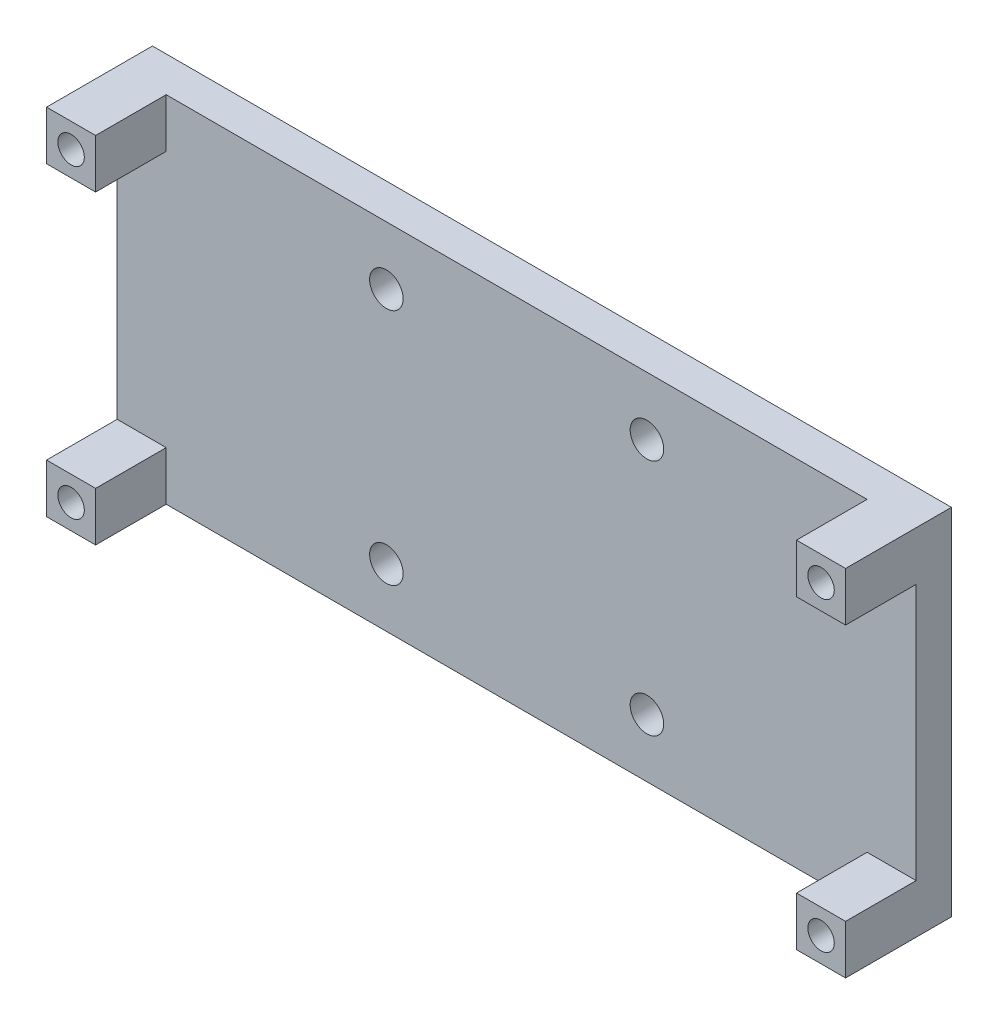
ISO-10303-21;
HEADER;
FILE_DESCRIPTION(('STEP AP214'),'2;1');
FILE_NAME('part.step','',(''),(''),'','','');
FILE_SCHEMA(('AUTOMOTIVE_DESIGN { 1 0 10303 214 1 1 1 1 }'));
ENDSEC;
DATA;
#1=APPLICATION_CONTEXT('core data for automotive mechanical design processes');
#2=APPLICATION_PROTOCOL_DEFINITION('international standard','automotive_design',2000,#1);
#3=PRODUCT_CONTEXT('',#1,'mechanical');
#4=PRODUCT('Part','Part','',(#3));
#5=PRODUCT_RELATED_PRODUCT_CATEGORY('part','',(#4));
#6=PRODUCT_DEFINITION_FORMATION('','',#4);
#7=PRODUCT_DEFINITION_CONTEXT('part definition',#1,'design');
#8=PRODUCT_DEFINITION('design','',#6,#7);
#9=PRODUCT_DEFINITION_SHAPE('','',#8);
#10=(LENGTH_UNIT() NAMED_UNIT(*) SI_UNIT(.MILLI.,.METRE.));
#11=(NAMED_UNIT(*) PLANE_ANGLE_UNIT() SI_UNIT($,.RADIAN.));
#12=(NAMED_UNIT(*) SI_UNIT($,.STERADIAN.) SOLID_ANGLE_UNIT());
#13=UNCERTAINTY_MEASURE_WITH_UNIT(LENGTH_MEASURE(1.E-05),#10,'distance_accuracy_value','');
#14=(GEOMETRIC_REPRESENTATION_CONTEXT(3) GLOBAL_UNCERTAINTY_ASSIGNED_CONTEXT((#13)) GLOBAL_UNIT_ASSIGNED_CONTEXT((#10,
#11,#12)) REPRESENTATION_CONTEXT('',''));
#15=CARTESIAN_POINT('',(0.,0.,0.));
#16=DIRECTION('',(0.,0.,1.));
#17=DIRECTION('',(1.,0.,0.));
#18=AXIS2_PLACEMENT_3D('',#15,#16,#17);
#19=CARTESIAN_POINT('',(0.,0.,2.));
#20=DIRECTION('',(0.,0.,1.));
#21=DIRECTION('',(1.,0.,0.));
#22=AXIS2_PLACEMENT_3D('',#19,#20,#21);
#23=PLANE('',#22);
#24=DIRECTION('',(-1.,0.,0.));
#25=VECTOR('',#24,1.);
#26=CARTESIAN_POINT('',(-5.51,7.77999999999999,2.));
#27=LINE('',#26,#25);
#28=CARTESIAN_POINT('',(-5.51,7.77999999999999,2.));
#29=VERTEX_POINT('',#28);
#30=CARTESIAN_POINT('',(-8.29,7.77999999999999,2.));
#31=VERTEX_POINT('',#30);
#32=EDGE_CURVE('E227',#29,#31,#27,.T.);
#33=ORIENTED_EDGE('',*,*,#32,.F.);
#34=DIRECTION('',(0.,1.,0.));
#35=VECTOR('',#34,1.);
#36=CARTESIAN_POINT('',(-5.51,7.77999999999999,2.));
#37=LINE('',#36,#35);
#38=CARTESIAN_POINT('',(-5.51,5.,2.));
#39=VERTEX_POINT('',#38);
#40=EDGE_CURVE('E230',#39,#29,#37,.T.);
#41=ORIENTED_EDGE('',*,*,#40,.F.);
#42=DIRECTION('',(1.,0.,0.));
#43=VECTOR('',#42,1.);
#44=CARTESIAN_POINT('',(-8.29,5.,2.));
#45=LINE('',#44,#43);
#46=CARTESIAN_POINT('',(34.21,5.,2.));
#47=VERTEX_POINT('',#46);
#48=EDGE_CURVE('E309',#39,#47,#45,.T.);
#49=ORIENTED_EDGE('',*,*,#48,.T.);
#50=DIRECTION('',(0.,-1.,0.));
#51=VECTOR('',#50,1.);
#52=CARTESIAN_POINT('',(34.21,7.77999999999999,2.));
#53=LINE('',#52,#51);
#54=CARTESIAN_POINT('',(34.21,7.77999999999999,2.));
#55=VERTEX_POINT('',#54);
#56=EDGE_CURVE('E200',#55,#47,#53,.T.);
#57=ORIENTED_EDGE('',*,*,#56,.F.);
#58=DIRECTION('',(-1.,0.,0.));
#59=VECTOR('',#58,1.);
#60=CARTESIAN_POINT('',(34.21,7.77999999999999,2.));
#61=LINE('',#60,#59);
#62=CARTESIAN_POINT('',(36.99,7.77999999999999,2.));
#63=VERTEX_POINT('',#62);
#64=EDGE_CURVE('E203',#63,#55,#61,.T.);
#65=ORIENTED_EDGE('',*,*,#64,.F.);
#66=DIRECTION('',(0.,1.,0.));
#67=VECTOR('',#66,1.);
#68=CARTESIAN_POINT('',(36.99,25.1,2.));
#69=LINE('',#68,#67);
#70=CARTESIAN_POINT('',(36.99,22.32,2.));
#71=VERTEX_POINT('',#70);
#72=EDGE_CURVE('E153',#63,#71,#69,.T.);
#73=ORIENTED_EDGE('',*,*,#72,.T.);
#74=DIRECTION('',(1.,0.,0.));
#75=VECTOR('',#74,1.);
#76=CARTESIAN_POINT('',(34.21,22.32,2.));
#77=LINE('',#76,#75);
#78=CARTESIAN_POINT('',(34.21,22.32,2.));
#79=VERTEX_POINT('',#78);
#80=EDGE_CURVE('E150',#79,#71,#77,.T.);
#81=ORIENTED_EDGE('',*,*,#80,.F.);
#82=DIRECTION('',(0.,-1.,0.));
#83=VECTOR('',#82,1.);
#84=CARTESIAN_POINT('',(34.21,22.32,2.));
#85=LINE('',#84,#83);
#86=CARTESIAN_POINT('',(34.21,25.1,2.));
#87=VERTEX_POINT('',#86);
#88=EDGE_CURVE('E61',#87,#79,#85,.T.);
#89=ORIENTED_EDGE('',*,*,#88,.F.);
#90=DIRECTION('',(-1.,0.,0.));
#91=VECTOR('',#90,1.);
#92=CARTESIAN_POINT('',(36.99,25.1,2.));
#93=LINE('',#92,#91);
#94=CARTESIAN_POINT('',(-5.51,25.1,2.));
#95=VERTEX_POINT('',#94);
#96=EDGE_CURVE('E56',#87,#95,#93,.T.);
#97=ORIENTED_EDGE('',*,*,#96,.T.);
#98=DIRECTION('',(0.,1.,0.));
#99=VECTOR('',#98,1.);
#100=CARTESIAN_POINT('',(-5.51,22.32,2.));
#101=LINE('',#100,#99);
#102=CARTESIAN_POINT('',(-5.51,22.32,2.));
#103=VERTEX_POINT('',#102);
#104=EDGE_CURVE('E251',#103,#95,#101,.T.);
#105=ORIENTED_EDGE('',*,*,#104,.F.);
#106=DIRECTION('',(1.,0.,0.));
#107=VECTOR('',#106,1.);
#108=CARTESIAN_POINT('',(-5.51,22.32,2.));
#109=LINE('',#108,#107);
#110=CARTESIAN_POINT('',(-8.29,22.32,2.));
#111=VERTEX_POINT('',#110);
#112=EDGE_CURVE('E246',#111,#103,#109,.T.);
#113=ORIENTED_EDGE('',*,*,#112,.F.);
#114=DIRECTION('',(0.,-1.,0.));
#115=VECTOR('',#114,1.);
#116=CARTESIAN_POINT('',(-8.29,25.1,2.));
#117=LINE('',#116,#115);
#118=EDGE_CURVE('E307',#111,#31,#117,.T.);
#119=ORIENTED_EDGE('',*,*,#118,.T.);
#120=EDGE_LOOP('',(#33,#41,#49,#57,#65,#73,#81,#89,#97,#105,#113,#119));
#121=FACE_BOUND('',#120,.T.);
#122=CARTESIAN_POINT('',(21.7326750383551,21.7950803759517,2.));
#123=DIRECTION('',(0.,0.,1.));
#124=DIRECTION('',(1.,0.,0.));
#125=AXIS2_PLACEMENT_3D('',#122,#123,#124);
#126=CIRCLE('',#125,0.949999999999997);
#127=CARTESIAN_POINT('',(22.6826750383551,21.7950803759517,2.));
#128=VERTEX_POINT('',#127);
#129=EDGE_CURVE('E289',#128,#128,#126,.T.);
#130=ORIENTED_EDGE('',*,*,#129,.F.);
#131=EDGE_LOOP('',(#130));
#132=FACE_BOUND('',#131,.T.);
#133=CARTESIAN_POINT('',(6.96732496164491,21.7950803759517,2.));
#134=DIRECTION('',(0.,0.,1.));
#135=DIRECTION('',(-1.,0.,0.));
#136=AXIS2_PLACEMENT_3D('',#133,#134,#135);
#137=CIRCLE('',#136,0.95);
#138=CARTESIAN_POINT('',(6.01732496164491,21.7950803759517,2.));
#139=VERTEX_POINT('',#138);
#140=EDGE_CURVE('E301',#139,#139,#137,.T.);
#141=ORIENTED_EDGE('',*,*,#140,.F.);
#142=EDGE_LOOP('',(#141));
#143=FACE_BOUND('',#142,.T.);
#144=CARTESIAN_POINT('',(21.7326750383551,8.3049196240483,2.));
#145=DIRECTION('',(0.,0.,1.));
#146=DIRECTION('',(-1.,0.,0.));
#147=AXIS2_PLACEMENT_3D('',#144,#145,#146);
#148=CIRCLE('',#147,0.950000000000001);
#149=CARTESIAN_POINT('',(20.7826750383551,8.3049196240483,2.));
#150=VERTEX_POINT('',#149);
#151=EDGE_CURVE('E295',#150,#150,#148,.T.);
#152=ORIENTED_EDGE('',*,*,#151,.F.);
#153=EDGE_LOOP('',(#152));
#154=FACE_BOUND('',#153,.T.);
#155=CARTESIAN_POINT('',(6.96732496164491,8.3049196240483,2.));
#156=DIRECTION('',(0.,0.,1.));
#157=DIRECTION('',(1.,0.,0.));
#158=AXIS2_PLACEMENT_3D('',#155,#156,#157);
#159=CIRCLE('',#158,0.95);
#160=CARTESIAN_POINT('',(7.91732496164491,8.3049196240483,2.));
#161=VERTEX_POINT('',#160);
#162=EDGE_CURVE('E283',#161,#161,#159,.T.);
#163=ORIENTED_EDGE('',*,*,#162,.F.);
#164=EDGE_LOOP('',(#163));
#165=FACE_BOUND('',#164,.T.);
#166=ADVANCED_FACE('F41',(#121,#132,#143,#154,#165),#23,.T.);
#167=CARTESIAN_POINT('',(0.,0.,0.));
#168=DIRECTION('',(0.,0.,1.));
#169=DIRECTION('',(1.,0.,0.));
#170=AXIS2_PLACEMENT_3D('',#167,#168,#169);
#171=PLANE('',#170);
#172=DIRECTION('',(0.,-1.,0.));
#173=VECTOR('',#172,1.);
#174=CARTESIAN_POINT('',(-8.29,25.1,0.));
#175=LINE('',#174,#173);
#176=CARTESIAN_POINT('',(-8.29,25.1,0.));
#177=VERTEX_POINT('',#176);
#178=CARTESIAN_POINT('',(-8.29,5.,0.));
#179=VERTEX_POINT('',#178);
#180=EDGE_CURVE('E304',#177,#179,#175,.T.);
#181=ORIENTED_EDGE('',*,*,#180,.F.);
#182=DIRECTION('',(-1.,0.,0.));
#183=VECTOR('',#182,1.);
#184=CARTESIAN_POINT('',(36.99,25.1,0.));
#185=LINE('',#184,#183);
#186=CARTESIAN_POINT('',(36.99,25.1,0.));
#187=VERTEX_POINT('',#186);
#188=EDGE_CURVE('E310',#187,#177,#185,.T.);
#189=ORIENTED_EDGE('',*,*,#188,.F.);
#190=DIRECTION('',(0.,1.,0.));
#191=VECTOR('',#190,1.);
#192=CARTESIAN_POINT('',(36.99,25.1,0.));
#193=LINE('',#192,#191);
#194=CARTESIAN_POINT('',(36.99,5.,0.));
#195=VERTEX_POINT('',#194);
#196=EDGE_CURVE('E319',#195,#187,#193,.T.);
#197=ORIENTED_EDGE('',*,*,#196,.F.);
#198=DIRECTION('',(1.,0.,0.));
#199=VECTOR('',#198,1.);
#200=CARTESIAN_POINT('',(36.99,5.,0.));
#201=LINE('',#200,#199);
#202=EDGE_CURVE('E317',#179,#195,#201,.T.);
#203=ORIENTED_EDGE('',*,*,#202,.F.);
#204=EDGE_LOOP('',(#181,#189,#197,#203));
#205=FACE_BOUND('',#204,.T.);
#206=CARTESIAN_POINT('',(6.96732496164491,21.7950803759517,0.));
#207=DIRECTION('',(0.,0.,1.));
#208=DIRECTION('',(-1.,0.,0.));
#209=AXIS2_PLACEMENT_3D('',#206,#207,#208);
#210=CIRCLE('',#209,0.95);
#211=CARTESIAN_POINT('',(6.01732496164491,21.7950803759517,0.));
#212=VERTEX_POINT('',#211);
#213=EDGE_CURVE('E298',#212,#212,#210,.T.);
#214=ORIENTED_EDGE('',*,*,#213,.T.);
#215=EDGE_LOOP('',(#214));
#216=FACE_BOUND('',#215,.T.);
#217=CARTESIAN_POINT('',(21.7326750383551,8.3049196240483,0.));
#218=DIRECTION('',(0.,0.,1.));
#219=DIRECTION('',(-1.,0.,0.));
#220=AXIS2_PLACEMENT_3D('',#217,#218,#219);
#221=CIRCLE('',#220,0.950000000000001);
#222=CARTESIAN_POINT('',(20.7826750383551,8.3049196240483,0.));
#223=VERTEX_POINT('',#222);
#224=EDGE_CURVE('E292',#223,#223,#221,.T.);
#225=ORIENTED_EDGE('',*,*,#224,.T.);
#226=EDGE_LOOP('',(#225));
#227=FACE_BOUND('',#226,.T.);
#228=CARTESIAN_POINT('',(21.7326750383551,21.7950803759517,0.));
#229=DIRECTION('',(0.,0.,1.));
#230=DIRECTION('',(1.,0.,0.));
#231=AXIS2_PLACEMENT_3D('',#228,#229,#230);
#232=CIRCLE('',#231,0.949999999999997);
#233=CARTESIAN_POINT('',(22.6826750383551,21.7950803759517,0.));
#234=VERTEX_POINT('',#233);
#235=EDGE_CURVE('E286',#234,#234,#232,.T.);
#236=ORIENTED_EDGE('',*,*,#235,.T.);
#237=EDGE_LOOP('',(#236));
#238=FACE_BOUND('',#237,.T.);
#239=CARTESIAN_POINT('',(6.96732496164491,8.3049196240483,0.));
#240=DIRECTION('',(0.,0.,1.));
#241=DIRECTION('',(1.,0.,0.));
#242=AXIS2_PLACEMENT_3D('',#239,#240,#241);
#243=CIRCLE('',#242,0.95);
#244=CARTESIAN_POINT('',(7.91732496164491,8.3049196240483,0.));
#245=VERTEX_POINT('',#244);
#246=EDGE_CURVE('E282',#245,#245,#243,.T.);
#247=ORIENTED_EDGE('',*,*,#246,.T.);
#248=EDGE_LOOP('',(#247));
#249=FACE_BOUND('',#248,.T.);
#250=CARTESIAN_POINT('',(35.6,23.71,0.));
#251=DIRECTION('',(0.,0.,1.));
#252=DIRECTION('',(1.,0.,0.));
#253=AXIS2_PLACEMENT_3D('',#250,#251,#252);
#254=CIRCLE('',#253,0.750000000000005);
#255=CARTESIAN_POINT('',(36.35,23.71,0.));
#256=VERTEX_POINT('',#255);
#257=EDGE_CURVE('E279',#256,#256,#254,.T.);
#258=ORIENTED_EDGE('',*,*,#257,.T.);
#259=EDGE_LOOP('',(#258));
#260=FACE_BOUND('',#259,.T.);
#261=CARTESIAN_POINT('',(35.6,6.39,0.));
#262=DIRECTION('',(0.,0.,1.));
#263=DIRECTION('',(1.,0.,0.));
#264=AXIS2_PLACEMENT_3D('',#261,#262,#263);
#265=CIRCLE('',#264,0.750000000000006);
#266=CARTESIAN_POINT('',(36.35,6.39,0.));
#267=VERTEX_POINT('',#266);
#268=EDGE_CURVE('E276',#267,#267,#265,.T.);
#269=ORIENTED_EDGE('',*,*,#268,.T.);
#270=EDGE_LOOP('',(#269));
#271=FACE_BOUND('',#270,.T.);
#272=CARTESIAN_POINT('',(-6.9,6.38999999999999,0.));
#273=DIRECTION('',(0.,0.,1.));
#274=DIRECTION('',(1.,0.,0.));
#275=AXIS2_PLACEMENT_3D('',#272,#273,#274);
#276=CIRCLE('',#275,0.750000000000001);
#277=CARTESIAN_POINT('',(-6.15,6.38999999999999,0.));
#278=VERTEX_POINT('',#277);
#279=EDGE_CURVE('E273',#278,#278,#276,.T.);
#280=ORIENTED_EDGE('',*,*,#279,.T.);
#281=EDGE_LOOP('',(#280));
#282=FACE_BOUND('',#281,.T.);
#283=CARTESIAN_POINT('',(-6.9,23.71,0.));
#284=DIRECTION('',(0.,0.,1.));
#285=DIRECTION('',(1.,0.,0.));
#286=AXIS2_PLACEMENT_3D('',#283,#284,#285);
#287=CIRCLE('',#286,0.750000000000001);
#288=CARTESIAN_POINT('',(-6.15,23.71,0.));
#289=VERTEX_POINT('',#288);
#290=EDGE_CURVE('E270',#289,#289,#287,.T.);
#291=ORIENTED_EDGE('',*,*,#290,.T.);
#292=EDGE_LOOP('',(#291));
#293=FACE_BOUND('',#292,.T.);
#294=ADVANCED_FACE('F337',(#205,#216,#227,#238,#249,#260,#271,#282,#293),#171,.F.);
#295=CARTESIAN_POINT('',(-8.29,25.1,2.));
#296=DIRECTION('',(1.,0.,0.));
#297=DIRECTION('',(0.,1.,0.));
#298=AXIS2_PLACEMENT_3D('',#295,#296,#297);
#299=PLANE('',#298);
#300=ORIENTED_EDGE('',*,*,#180,.T.);
#301=DIRECTION('',(0.,0.,-1.));
#302=VECTOR('',#301,1.);
#303=CARTESIAN_POINT('',(-8.29,5.,2.));
#304=LINE('',#303,#302);
#305=CARTESIAN_POINT('',(-8.29,5.,6.));
#306=VERTEX_POINT('',#305);
#307=EDGE_CURVE('E11',#306,#179,#304,.T.);
#308=ORIENTED_EDGE('',*,*,#307,.F.);
#309=DIRECTION('',(0.,-1.,0.));
#310=VECTOR('',#309,1.);
#311=CARTESIAN_POINT('',(-8.29,5.,6.));
#312=LINE('',#311,#310);
#313=CARTESIAN_POINT('',(-8.29,7.77999999999999,6.));
#314=VERTEX_POINT('',#313);
#315=EDGE_CURVE('E226',#314,#306,#312,.T.);
#316=ORIENTED_EDGE('',*,*,#315,.F.);
#317=DIRECTION('',(0.,0.,-1.));
#318=VECTOR('',#317,1.);
#319=CARTESIAN_POINT('',(-8.29,7.77999999999999,6.));
#320=LINE('',#319,#318);
#321=EDGE_CURVE('E223',#314,#31,#320,.T.);
#322=ORIENTED_EDGE('',*,*,#321,.T.);
#323=ORIENTED_EDGE('',*,*,#118,.F.);
#324=DIRECTION('',(0.,0.,-1.));
#325=VECTOR('',#324,1.);
#326=CARTESIAN_POINT('',(-8.29,22.32,6.));
#327=LINE('',#326,#325);
#328=CARTESIAN_POINT('',(-8.29,22.32,6.));
#329=VERTEX_POINT('',#328);
#330=EDGE_CURVE('E267',#329,#111,#327,.T.);
#331=ORIENTED_EDGE('',*,*,#330,.F.);
#332=DIRECTION('',(0.,-1.,0.));
#333=VECTOR('',#332,1.);
#334=CARTESIAN_POINT('',(-8.29,25.1,6.));
#335=LINE('',#334,#333);
#336=CARTESIAN_POINT('',(-8.29,25.1,6.));
#337=VERTEX_POINT('',#336);
#338=EDGE_CURVE('E247',#337,#329,#335,.T.);
#339=ORIENTED_EDGE('',*,*,#338,.F.);
#340=DIRECTION('',(0.,0.,-1.));
#341=VECTOR('',#340,1.);
#342=CARTESIAN_POINT('',(-8.29,25.1,2.));
#343=LINE('',#342,#341);
#344=EDGE_CURVE('E314',#337,#177,#343,.T.);
#345=ORIENTED_EDGE('',*,*,#344,.T.);
#346=EDGE_LOOP('',(#300,#308,#316,#322,#323,#331,#339,#345));
#347=FACE_BOUND('',#346,.T.);
#348=ADVANCED_FACE('F43',(#347),#299,.F.);
#349=CARTESIAN_POINT('',(36.99,5.,2.));
#350=DIRECTION('',(0.,1.,0.));
#351=DIRECTION('',(-1.,0.,0.));
#352=AXIS2_PLACEMENT_3D('',#349,#350,#351);
#353=PLANE('',#352);
#354=ORIENTED_EDGE('',*,*,#202,.T.);
#355=DIRECTION('',(0.,0.,-1.));
#356=VECTOR('',#355,1.);
#357=CARTESIAN_POINT('',(36.99,5.,2.));
#358=LINE('',#357,#356);
#359=CARTESIAN_POINT('',(36.99,5.,6.));
#360=VERTEX_POINT('',#359);
#361=EDGE_CURVE('E49',#360,#195,#358,.T.);
#362=ORIENTED_EDGE('',*,*,#361,.F.);
#363=DIRECTION('',(1.,0.,0.));
#364=VECTOR('',#363,1.);
#365=CARTESIAN_POINT('',(34.21,4.99999999999999,6.));
#366=LINE('',#365,#364);
#367=CARTESIAN_POINT('',(34.21,4.99999999999999,6.));
#368=VERTEX_POINT('',#367);
#369=EDGE_CURVE('E199',#368,#360,#366,.T.);
#370=ORIENTED_EDGE('',*,*,#369,.F.);
#371=DIRECTION('',(0.,0.,-1.));
#372=VECTOR('',#371,1.);
#373=CARTESIAN_POINT('',(34.21,4.99999999999999,6.));
#374=LINE('',#373,#372);
#375=EDGE_CURVE('E196',#368,#47,#374,.T.);
#376=ORIENTED_EDGE('',*,*,#375,.T.);
#377=ORIENTED_EDGE('',*,*,#48,.F.);
#378=DIRECTION('',(0.,0.,-1.));
#379=VECTOR('',#378,1.);
#380=CARTESIAN_POINT('',(-5.51,4.99999999999999,6.));
#381=LINE('',#380,#379);
#382=CARTESIAN_POINT('',(-5.51,4.99999999999999,6.));
#383=VERTEX_POINT('',#382);
#384=EDGE_CURVE('E217',#383,#39,#381,.T.);
#385=ORIENTED_EDGE('',*,*,#384,.F.);
#386=DIRECTION('',(1.,0.,0.));
#387=VECTOR('',#386,1.);
#388=CARTESIAN_POINT('',(-5.51,4.99999999999999,6.));
#389=LINE('',#388,#387);
#390=EDGE_CURVE('E231',#306,#383,#389,.T.);
#391=ORIENTED_EDGE('',*,*,#390,.F.);
#392=ORIENTED_EDGE('',*,*,#307,.T.);
#393=EDGE_LOOP('',(#354,#362,#370,#376,#377,#385,#391,#392));
#394=FACE_BOUND('',#393,.T.);
#395=ADVANCED_FACE('F383',(#394),#353,.F.);
#396=CARTESIAN_POINT('',(36.99,25.1,2.));
#397=DIRECTION('',(-1.,0.,0.));
#398=DIRECTION('',(0.,0.,1.));
#399=AXIS2_PLACEMENT_3D('',#396,#397,#398);
#400=PLANE('',#399);
#401=ORIENTED_EDGE('',*,*,#196,.T.);
#402=DIRECTION('',(0.,0.,-1.));
#403=VECTOR('',#402,1.);
#404=CARTESIAN_POINT('',(36.99,25.1,2.));
#405=LINE('',#404,#403);
#406=CARTESIAN_POINT('',(36.99,25.1,6.));
#407=VERTEX_POINT('',#406);
#408=EDGE_CURVE('E324',#407,#187,#405,.T.);
#409=ORIENTED_EDGE('',*,*,#408,.F.);
#410=DIRECTION('',(0.,1.,0.));
#411=VECTOR('',#410,1.);
#412=CARTESIAN_POINT('',(36.99,25.1,6.));
#413=LINE('',#412,#411);
#414=CARTESIAN_POINT('',(36.99,22.32,6.));
#415=VERTEX_POINT('',#414);
#416=EDGE_CURVE('E174',#415,#407,#413,.T.);
#417=ORIENTED_EDGE('',*,*,#416,.F.);
#418=DIRECTION('',(0.,0.,-1.));
#419=VECTOR('',#418,1.);
#420=CARTESIAN_POINT('',(36.99,22.32,6.));
#421=LINE('',#420,#419);
#422=EDGE_CURVE('E172',#415,#71,#421,.T.);
#423=ORIENTED_EDGE('',*,*,#422,.T.);
#424=ORIENTED_EDGE('',*,*,#72,.F.);
#425=DIRECTION('',(0.,0.,-1.));
#426=VECTOR('',#425,1.);
#427=CARTESIAN_POINT('',(36.99,7.77999999999999,6.));
#428=LINE('',#427,#426);
#429=CARTESIAN_POINT('',(36.99,7.77999999999999,6.));
#430=VERTEX_POINT('',#429);
#431=EDGE_CURVE('E189',#430,#63,#428,.T.);
#432=ORIENTED_EDGE('',*,*,#431,.F.);
#433=DIRECTION('',(0.,1.,0.));
#434=VECTOR('',#433,1.);
#435=CARTESIAN_POINT('',(36.99,5.,6.));
#436=LINE('',#435,#434);
#437=EDGE_CURVE('E204',#360,#430,#436,.T.);
#438=ORIENTED_EDGE('',*,*,#437,.F.);
#439=ORIENTED_EDGE('',*,*,#361,.T.);
#440=EDGE_LOOP('',(#401,#409,#417,#423,#424,#432,#438,#439));
#441=FACE_BOUND('',#440,.T.);
#442=ADVANCED_FACE('F330',(#441),#400,.F.);
#443=CARTESIAN_POINT('',(36.99,25.1,2.));
#444=DIRECTION('',(0.,-1.,0.));
#445=DIRECTION('',(1.,0.,0.));
#446=AXIS2_PLACEMENT_3D('',#443,#444,#445);
#447=PLANE('',#446);
#448=ORIENTED_EDGE('',*,*,#188,.T.);
#449=ORIENTED_EDGE('',*,*,#344,.F.);
#450=DIRECTION('',(-1.,0.,0.));
#451=VECTOR('',#450,1.);
#452=CARTESIAN_POINT('',(-5.51,25.1,6.));
#453=LINE('',#452,#451);
#454=CARTESIAN_POINT('',(-5.51,25.1,6.));
#455=VERTEX_POINT('',#454);
#456=EDGE_CURVE('E255',#455,#337,#453,.T.);
#457=ORIENTED_EDGE('',*,*,#456,.F.);
#458=DIRECTION('',(0.,0.,-1.));
#459=VECTOR('',#458,1.);
#460=CARTESIAN_POINT('',(-5.51,25.1,6.));
#461=LINE('',#460,#459);
#462=EDGE_CURVE('E258',#455,#95,#461,.T.);
#463=ORIENTED_EDGE('',*,*,#462,.T.);
#464=ORIENTED_EDGE('',*,*,#96,.F.);
#465=DIRECTION('',(0.,0.,-1.));
#466=VECTOR('',#465,1.);
#467=CARTESIAN_POINT('',(34.21,25.1,6.));
#468=LINE('',#467,#466);
#469=CARTESIAN_POINT('',(34.21,25.1,6.));
#470=VERTEX_POINT('',#469);
#471=EDGE_CURVE('E167',#470,#87,#468,.T.);
#472=ORIENTED_EDGE('',*,*,#471,.F.);
#473=DIRECTION('',(-1.,0.,0.));
#474=VECTOR('',#473,1.);
#475=CARTESIAN_POINT('',(34.21,25.1,6.));
#476=LINE('',#475,#474);
#477=EDGE_CURVE('E158',#407,#470,#476,.T.);
#478=ORIENTED_EDGE('',*,*,#477,.F.);
#479=ORIENTED_EDGE('',*,*,#408,.T.);
#480=EDGE_LOOP('',(#448,#449,#457,#463,#464,#472,#478,#479));
#481=FACE_BOUND('',#480,.T.);
#482=ADVANCED_FACE('F340',(#481),#447,.F.);
#483=CARTESIAN_POINT('',(6.96732496164491,21.7950803759517,2.));
#484=DIRECTION('',(0.,0.,-1.));
#485=DIRECTION('',(-1.,0.,0.));
#486=AXIS2_PLACEMENT_3D('',#483,#484,#485);
#487=CYLINDRICAL_SURFACE('',#486,0.95);
#488=ORIENTED_EDGE('',*,*,#140,.T.);
#489=EDGE_LOOP('',(#488));
#490=FACE_BOUND('',#489,.T.);
#491=ORIENTED_EDGE('',*,*,#213,.F.);
#492=EDGE_LOOP('',(#491));
#493=FACE_BOUND('',#492,.T.);
#494=ADVANCED_FACE('F377',(#490,#493),#487,.F.);
#495=CARTESIAN_POINT('',(21.7326750383551,8.3049196240483,2.));
#496=DIRECTION('',(0.,0.,-1.));
#497=DIRECTION('',(-1.,0.,0.));
#498=AXIS2_PLACEMENT_3D('',#495,#496,#497);
#499=CYLINDRICAL_SURFACE('',#498,0.950000000000001);
#500=ORIENTED_EDGE('',*,*,#151,.T.);
#501=EDGE_LOOP('',(#500));
#502=FACE_BOUND('',#501,.T.);
#503=ORIENTED_EDGE('',*,*,#224,.F.);
#504=EDGE_LOOP('',(#503));
#505=FACE_BOUND('',#504,.T.);
#506=ADVANCED_FACE('F434',(#502,#505),#499,.F.);
#507=CARTESIAN_POINT('',(21.7326750383551,21.7950803759517,2.));
#508=DIRECTION('',(0.,0.,-1.));
#509=DIRECTION('',(-1.,0.,0.));
#510=AXIS2_PLACEMENT_3D('',#507,#508,#509);
#511=CYLINDRICAL_SURFACE('',#510,0.949999999999997);
#512=ORIENTED_EDGE('',*,*,#129,.T.);
#513=EDGE_LOOP('',(#512));
#514=FACE_BOUND('',#513,.T.);
#515=ORIENTED_EDGE('',*,*,#235,.F.);
#516=EDGE_LOOP('',(#515));
#517=FACE_BOUND('',#516,.T.);
#518=ADVANCED_FACE('F427',(#514,#517),#511,.F.);
#519=CARTESIAN_POINT('',(6.96732496164491,8.3049196240483,2.));
#520=DIRECTION('',(0.,0.,-1.));
#521=DIRECTION('',(-1.,0.,0.));
#522=AXIS2_PLACEMENT_3D('',#519,#520,#521);
#523=CYLINDRICAL_SURFACE('',#522,0.95);
#524=ORIENTED_EDGE('',*,*,#162,.T.);
#525=EDGE_LOOP('',(#524));
#526=FACE_BOUND('',#525,.T.);
#527=ORIENTED_EDGE('',*,*,#246,.F.);
#528=EDGE_LOOP('',(#527));
#529=FACE_BOUND('',#528,.T.);
#530=ADVANCED_FACE('F418',(#526,#529),#523,.F.);
#531=CARTESIAN_POINT('',(35.6,23.71,2.));
#532=DIRECTION('',(0.,0.,-1.));
#533=DIRECTION('',(-1.,0.,0.));
#534=AXIS2_PLACEMENT_3D('',#531,#532,#533);
#535=CYLINDRICAL_SURFACE('',#534,0.750000000000005);
#536=ORIENTED_EDGE('',*,*,#257,.F.);
#537=EDGE_LOOP('',(#536));
#538=FACE_BOUND('',#537,.T.);
#539=CARTESIAN_POINT('',(35.6,23.71,6.));
#540=DIRECTION('',(0.,0.,1.));
#541=DIRECTION('',(-1.,0.,0.));
#542=AXIS2_PLACEMENT_3D('',#539,#540,#541);
#543=CIRCLE('',#542,0.750000000000005);
#544=CARTESIAN_POINT('',(34.85,23.71,6.));
#545=VERTEX_POINT('',#544);
#546=EDGE_CURVE('E168',#545,#545,#543,.T.);
#547=ORIENTED_EDGE('',*,*,#546,.T.);
#548=EDGE_LOOP('',(#547));
#549=FACE_BOUND('',#548,.T.);
#550=ADVANCED_FACE('F415',(#538,#549),#535,.F.);
#551=CARTESIAN_POINT('',(35.6,6.39,2.));
#552=DIRECTION('',(0.,0.,-1.));
#553=DIRECTION('',(-1.,0.,0.));
#554=AXIS2_PLACEMENT_3D('',#551,#552,#553);
#555=CYLINDRICAL_SURFACE('',#554,0.750000000000006);
#556=ORIENTED_EDGE('',*,*,#268,.F.);
#557=EDGE_LOOP('',(#556));
#558=FACE_BOUND('',#557,.T.);
#559=CARTESIAN_POINT('',(35.6,6.39,6.));
#560=DIRECTION('',(0.,0.,1.));
#561=DIRECTION('',(1.,0.,0.));
#562=AXIS2_PLACEMENT_3D('',#559,#560,#561);
#563=CIRCLE('',#562,0.750000000000005);
#564=CARTESIAN_POINT('',(36.35,6.39,6.));
#565=VERTEX_POINT('',#564);
#566=EDGE_CURVE('E176',#565,#565,#563,.T.);
#567=ORIENTED_EDGE('',*,*,#566,.T.);
#568=EDGE_LOOP('',(#567));
#569=FACE_BOUND('',#568,.T.);
#570=ADVANCED_FACE('F417',(#558,#569),#555,.F.);
#571=CARTESIAN_POINT('',(-6.9,6.38999999999999,2.));
#572=DIRECTION('',(0.,0.,-1.));
#573=DIRECTION('',(-1.,0.,0.));
#574=AXIS2_PLACEMENT_3D('',#571,#572,#573);
#575=CYLINDRICAL_SURFACE('',#574,0.750000000000001);
#576=ORIENTED_EDGE('',*,*,#279,.F.);
#577=EDGE_LOOP('',(#576));
#578=FACE_BOUND('',#577,.T.);
#579=CARTESIAN_POINT('',(-6.9,6.38999999999999,6.));
#580=DIRECTION('',(0.,0.,1.));
#581=DIRECTION('',(-1.,0.,0.));
#582=AXIS2_PLACEMENT_3D('',#579,#580,#581);
#583=CIRCLE('',#582,0.750000000000001);
#584=CARTESIAN_POINT('',(-7.65,6.38999999999999,6.));
#585=VERTEX_POINT('',#584);
#586=EDGE_CURVE('E193',#585,#585,#583,.T.);
#587=ORIENTED_EDGE('',*,*,#586,.T.);
#588=EDGE_LOOP('',(#587));
#589=FACE_BOUND('',#588,.T.);
#590=ADVANCED_FACE('F424',(#578,#589),#575,.F.);
#591=CARTESIAN_POINT('',(-6.9,23.71,2.));
#592=DIRECTION('',(0.,0.,-1.));
#593=DIRECTION('',(-1.,0.,0.));
#594=AXIS2_PLACEMENT_3D('',#591,#592,#593);
#595=CYLINDRICAL_SURFACE('',#594,0.750000000000001);
#596=ORIENTED_EDGE('',*,*,#290,.F.);
#597=EDGE_LOOP('',(#596));
#598=FACE_BOUND('',#597,.T.);
#599=CARTESIAN_POINT('',(-6.9,23.71,6.));
#600=DIRECTION('',(0.,0.,1.));
#601=DIRECTION('',(1.,0.,0.));
#602=AXIS2_PLACEMENT_3D('',#599,#600,#601);
#603=CIRCLE('',#602,0.750000000000001);
#604=CARTESIAN_POINT('',(-6.15,23.71,6.));
#605=VERTEX_POINT('',#604);
#606=EDGE_CURVE('E188',#605,#605,#603,.T.);
#607=ORIENTED_EDGE('',*,*,#606,.T.);
#608=EDGE_LOOP('',(#607));
#609=FACE_BOUND('',#608,.T.);
#610=ADVANCED_FACE('F365',(#598,#609),#595,.F.);
#611=CARTESIAN_POINT('',(0.,0.,6.));
#612=DIRECTION('',(0.,0.,-1.));
#613=DIRECTION('',(-1.,0.,0.));
#614=AXIS2_PLACEMENT_3D('',#611,#612,#613);
#615=PLANE('',#614);
#616=ORIENTED_EDGE('',*,*,#338,.T.);
#617=DIRECTION('',(1.,0.,0.));
#618=VECTOR('',#617,1.);
#619=CARTESIAN_POINT('',(-5.51,22.32,6.));
#620=LINE('',#619,#618);
#621=CARTESIAN_POINT('',(-5.51,22.32,6.));
#622=VERTEX_POINT('',#621);
#623=EDGE_CURVE('E250',#329,#622,#620,.T.);
#624=ORIENTED_EDGE('',*,*,#623,.T.);
#625=DIRECTION('',(0.,1.,0.));
#626=VECTOR('',#625,1.);
#627=CARTESIAN_POINT('',(-5.51,22.32,6.));
#628=LINE('',#627,#626);
#629=EDGE_CURVE('E253',#622,#455,#628,.T.);
#630=ORIENTED_EDGE('',*,*,#629,.T.);
#631=ORIENTED_EDGE('',*,*,#456,.T.);
#632=EDGE_LOOP('',(#616,#624,#630,#631));
#633=FACE_BOUND('',#632,.T.);
#634=ORIENTED_EDGE('',*,*,#606,.F.);
#635=EDGE_LOOP('',(#634));
#636=FACE_BOUND('',#635,.T.);
#637=ADVANCED_FACE('F348',(#633,#636),#615,.F.);
#638=CARTESIAN_POINT('',(-5.51,22.32,6.));
#639=DIRECTION('',(0.,1.,0.));
#640=DIRECTION('',(0.,0.,1.));
#641=AXIS2_PLACEMENT_3D('',#638,#639,#640);
#642=PLANE('',#641);
#643=ORIENTED_EDGE('',*,*,#112,.T.);
#644=DIRECTION('',(0.,0.,-1.));
#645=VECTOR('',#644,1.);
#646=CARTESIAN_POINT('',(-5.51,22.32,6.));
#647=LINE('',#646,#645);
#648=EDGE_CURVE('E264',#622,#103,#647,.T.);
#649=ORIENTED_EDGE('',*,*,#648,.F.);
#650=ORIENTED_EDGE('',*,*,#623,.F.);
#651=ORIENTED_EDGE('',*,*,#330,.T.);
#652=EDGE_LOOP('',(#643,#649,#650,#651));
#653=FACE_BOUND('',#652,.T.);
#654=ADVANCED_FACE('F356',(#653),#642,.F.);
#655=CARTESIAN_POINT('',(-5.51,22.32,6.));
#656=DIRECTION('',(-1.,0.,0.));
#657=DIRECTION('',(0.,-1.,0.));
#658=AXIS2_PLACEMENT_3D('',#655,#656,#657);
#659=PLANE('',#658);
#660=ORIENTED_EDGE('',*,*,#104,.T.);
#661=ORIENTED_EDGE('',*,*,#462,.F.);
#662=ORIENTED_EDGE('',*,*,#629,.F.);
#663=ORIENTED_EDGE('',*,*,#648,.T.);
#664=EDGE_LOOP('',(#660,#661,#662,#663));
#665=FACE_BOUND('',#664,.T.);
#666=ADVANCED_FACE('F354',(#665),#659,.F.);
#667=CARTESIAN_POINT('',(0.,0.,6.));
#668=DIRECTION('',(0.,0.,-1.));
#669=DIRECTION('',(-1.,0.,0.));
#670=AXIS2_PLACEMENT_3D('',#667,#668,#669);
#671=PLANE('',#670);
#672=ORIENTED_EDGE('',*,*,#477,.T.);
#673=DIRECTION('',(0.,-1.,0.));
#674=VECTOR('',#673,1.);
#675=CARTESIAN_POINT('',(34.21,22.32,6.));
#676=LINE('',#675,#674);
#677=CARTESIAN_POINT('',(34.21,22.32,6.));
#678=VERTEX_POINT('',#677);
#679=EDGE_CURVE('E182',#470,#678,#676,.T.);
#680=ORIENTED_EDGE('',*,*,#679,.T.);
#681=DIRECTION('',(1.,0.,0.));
#682=VECTOR('',#681,1.);
#683=CARTESIAN_POINT('',(34.21,22.32,6.));
#684=LINE('',#683,#682);
#685=EDGE_CURVE('E171',#678,#415,#684,.T.);
#686=ORIENTED_EDGE('',*,*,#685,.T.);
#687=ORIENTED_EDGE('',*,*,#416,.T.);
#688=EDGE_LOOP('',(#672,#680,#686,#687));
#689=FACE_BOUND('',#688,.T.);
#690=ORIENTED_EDGE('',*,*,#546,.F.);
#691=EDGE_LOOP('',(#690));
#692=FACE_BOUND('',#691,.T.);
#693=ADVANCED_FACE('F363',(#689,#692),#671,.F.);
#694=CARTESIAN_POINT('',(34.21,22.32,6.));
#695=DIRECTION('',(1.,0.,0.));
#696=DIRECTION('',(0.,1.,0.));
#697=AXIS2_PLACEMENT_3D('',#694,#695,#696);
#698=PLANE('',#697);
#699=ORIENTED_EDGE('',*,*,#88,.T.);
#700=DIRECTION('',(0.,0.,-1.));
#701=VECTOR('',#700,1.);
#702=CARTESIAN_POINT('',(34.21,22.32,6.));
#703=LINE('',#702,#701);
#704=EDGE_CURVE('E164',#678,#79,#703,.T.);
#705=ORIENTED_EDGE('',*,*,#704,.F.);
#706=ORIENTED_EDGE('',*,*,#679,.F.);
#707=ORIENTED_EDGE('',*,*,#471,.T.);
#708=EDGE_LOOP('',(#699,#705,#706,#707));
#709=FACE_BOUND('',#708,.T.);
#710=ADVANCED_FACE('F163',(#709),#698,.F.);
#711=CARTESIAN_POINT('',(34.21,22.32,6.));
#712=DIRECTION('',(0.,1.,0.));
#713=DIRECTION('',(0.,0.,1.));
#714=AXIS2_PLACEMENT_3D('',#711,#712,#713);
#715=PLANE('',#714);
#716=ORIENTED_EDGE('',*,*,#80,.T.);
#717=ORIENTED_EDGE('',*,*,#422,.F.);
#718=ORIENTED_EDGE('',*,*,#685,.F.);
#719=ORIENTED_EDGE('',*,*,#704,.T.);
#720=EDGE_LOOP('',(#716,#717,#718,#719));
#721=FACE_BOUND('',#720,.T.);
#722=ADVANCED_FACE('F170',(#721),#715,.F.);
#723=CARTESIAN_POINT('',(0.,0.,6.));
#724=DIRECTION('',(0.,0.,-1.));
#725=DIRECTION('',(-1.,0.,0.));
#726=AXIS2_PLACEMENT_3D('',#723,#724,#725);
#727=PLANE('',#726);
#728=ORIENTED_EDGE('',*,*,#437,.T.);
#729=DIRECTION('',(-1.,0.,0.));
#730=VECTOR('',#729,1.);
#731=CARTESIAN_POINT('',(34.21,7.77999999999999,6.));
#732=LINE('',#731,#730);
#733=CARTESIAN_POINT('',(34.21,7.77999999999999,6.));
#734=VERTEX_POINT('',#733);
#735=EDGE_CURVE('E211',#430,#734,#732,.T.);
#736=ORIENTED_EDGE('',*,*,#735,.T.);
#737=DIRECTION('',(0.,-1.,0.));
#738=VECTOR('',#737,1.);
#739=CARTESIAN_POINT('',(34.21,7.77999999999999,6.));
#740=LINE('',#739,#738);
#741=EDGE_CURVE('E209',#734,#368,#740,.T.);
#742=ORIENTED_EDGE('',*,*,#741,.T.);
#743=ORIENTED_EDGE('',*,*,#369,.T.);
#744=EDGE_LOOP('',(#728,#736,#742,#743));
#745=FACE_BOUND('',#744,.T.);
#746=ORIENTED_EDGE('',*,*,#566,.F.);
#747=EDGE_LOOP('',(#746));
#748=FACE_BOUND('',#747,.T.);
#749=ADVANCED_FACE('F480',(#745,#748),#727,.F.);
#750=CARTESIAN_POINT('',(34.21,7.77999999999999,6.));
#751=DIRECTION('',(0.,-1.,0.));
#752=DIRECTION('',(0.,0.,-1.));
#753=AXIS2_PLACEMENT_3D('',#750,#751,#752);
#754=PLANE('',#753);
#755=ORIENTED_EDGE('',*,*,#64,.T.);
#756=DIRECTION('',(0.,0.,-1.));
#757=VECTOR('',#756,1.);
#758=CARTESIAN_POINT('',(34.21,7.77999999999999,6.));
#759=LINE('',#758,#757);
#760=EDGE_CURVE('E192',#734,#55,#759,.T.);
#761=ORIENTED_EDGE('',*,*,#760,.F.);
#762=ORIENTED_EDGE('',*,*,#735,.F.);
#763=ORIENTED_EDGE('',*,*,#431,.T.);
#764=EDGE_LOOP('',(#755,#761,#762,#763));
#765=FACE_BOUND('',#764,.T.);
#766=ADVANCED_FACE('F407',(#765),#754,.F.);
#767=CARTESIAN_POINT('',(34.21,7.77999999999999,6.));
#768=DIRECTION('',(1.,0.,0.));
#769=DIRECTION('',(0.,1.,0.));
#770=AXIS2_PLACEMENT_3D('',#767,#768,#769);
#771=PLANE('',#770);
#772=ORIENTED_EDGE('',*,*,#56,.T.);
#773=ORIENTED_EDGE('',*,*,#375,.F.);
#774=ORIENTED_EDGE('',*,*,#741,.F.);
#775=ORIENTED_EDGE('',*,*,#760,.T.);
#776=EDGE_LOOP('',(#772,#773,#774,#775));
#777=FACE_BOUND('',#776,.T.);
#778=ADVANCED_FACE('F403',(#777),#771,.F.);
#779=CARTESIAN_POINT('',(0.,0.,6.));
#780=DIRECTION('',(0.,0.,-1.));
#781=DIRECTION('',(-1.,0.,0.));
#782=AXIS2_PLACEMENT_3D('',#779,#780,#781);
#783=PLANE('',#782);
#784=ORIENTED_EDGE('',*,*,#390,.T.);
#785=DIRECTION('',(0.,1.,0.));
#786=VECTOR('',#785,1.);
#787=CARTESIAN_POINT('',(-5.51,7.77999999999999,6.));
#788=LINE('',#787,#786);
#789=CARTESIAN_POINT('',(-5.51,7.77999999999999,6.));
#790=VERTEX_POINT('',#789);
#791=EDGE_CURVE('E238',#383,#790,#788,.T.);
#792=ORIENTED_EDGE('',*,*,#791,.T.);
#793=DIRECTION('',(-1.,0.,0.));
#794=VECTOR('',#793,1.);
#795=CARTESIAN_POINT('',(-5.51,7.77999999999999,6.));
#796=LINE('',#795,#794);
#797=EDGE_CURVE('E236',#790,#314,#796,.T.);
#798=ORIENTED_EDGE('',*,*,#797,.T.);
#799=ORIENTED_EDGE('',*,*,#315,.T.);
#800=EDGE_LOOP('',(#784,#792,#798,#799));
#801=FACE_BOUND('',#800,.T.);
#802=ORIENTED_EDGE('',*,*,#586,.F.);
#803=EDGE_LOOP('',(#802));
#804=FACE_BOUND('',#803,.T.);
#805=ADVANCED_FACE('F391',(#801,#804),#783,.F.);
#806=CARTESIAN_POINT('',(-5.51,7.77999999999999,6.));
#807=DIRECTION('',(-1.,0.,0.));
#808=DIRECTION('',(0.,-1.,0.));
#809=AXIS2_PLACEMENT_3D('',#806,#807,#808);
#810=PLANE('',#809);
#811=ORIENTED_EDGE('',*,*,#40,.T.);
#812=DIRECTION('',(0.,0.,-1.));
#813=VECTOR('',#812,1.);
#814=CARTESIAN_POINT('',(-5.51,7.77999999999999,6.));
#815=LINE('',#814,#813);
#816=EDGE_CURVE('E220',#790,#29,#815,.T.);
#817=ORIENTED_EDGE('',*,*,#816,.F.);
#818=ORIENTED_EDGE('',*,*,#791,.F.);
#819=ORIENTED_EDGE('',*,*,#384,.T.);
#820=EDGE_LOOP('',(#811,#817,#818,#819));
#821=FACE_BOUND('',#820,.T.);
#822=ADVANCED_FACE('F400',(#821),#810,.F.);
#823=CARTESIAN_POINT('',(-5.51,7.77999999999999,6.));
#824=DIRECTION('',(0.,-1.,0.));
#825=DIRECTION('',(0.,0.,-1.));
#826=AXIS2_PLACEMENT_3D('',#823,#824,#825);
#827=PLANE('',#826);
#828=ORIENTED_EDGE('',*,*,#32,.T.);
#829=ORIENTED_EDGE('',*,*,#321,.F.);
#830=ORIENTED_EDGE('',*,*,#797,.F.);
#831=ORIENTED_EDGE('',*,*,#816,.T.);
#832=EDGE_LOOP('',(#828,#829,#830,#831));
#833=FACE_BOUND('',#832,.T.);
#834=ADVANCED_FACE('F397',(#833),#827,.F.);
#835=CLOSED_SHELL('',(#166,#294,#348,#395,#442,#482,#494,#506,#518,#530,#550,#570,#590,#610,
#637,#654,#666,#693,#710,#722,#749,#766,#778,#805,#822,#834));
#836=MANIFOLD_SOLID_BREP('B2',#835);
#837=ADVANCED_BREP_SHAPE_REPRESENTATION('',(#18,#836),#14);
#838=SHAPE_DEFINITION_REPRESENTATION(#9,#837);
ENDSEC;
END-ISO-10303-21;
